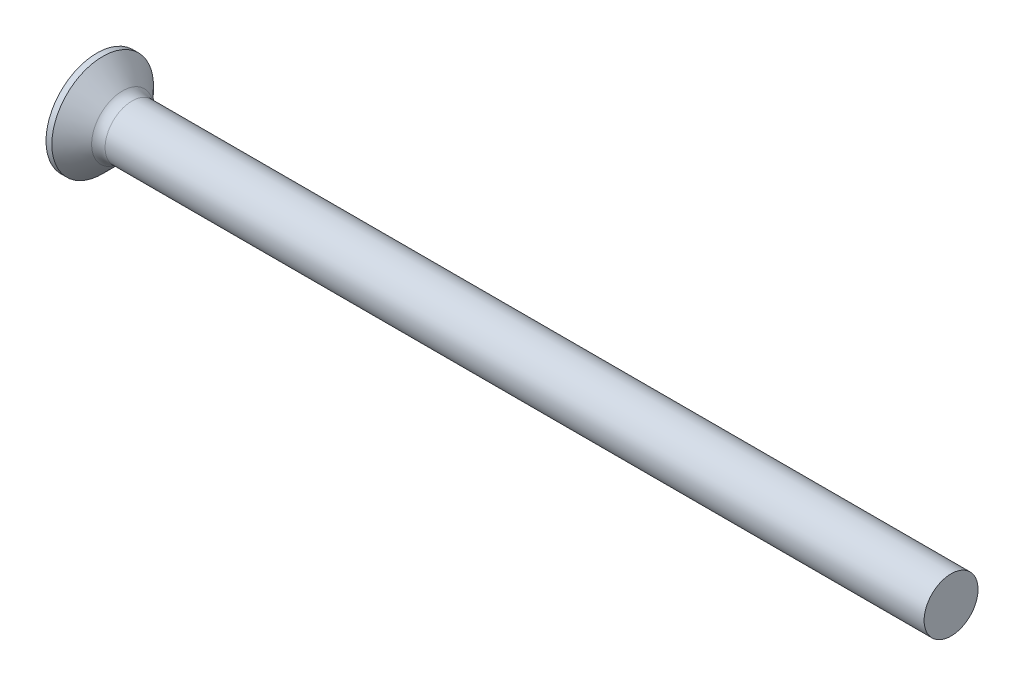
ISO-10303-21;
HEADER;
FILE_DESCRIPTION(('STEP AP214'),'2;1');
FILE_NAME('part.step','',(''),(''),'','','');
FILE_SCHEMA(('AUTOMOTIVE_DESIGN { 1 0 10303 214 1 1 1 1 }'));
ENDSEC;
DATA;
#1=APPLICATION_CONTEXT('core data for automotive mechanical design processes');
#2=APPLICATION_PROTOCOL_DEFINITION('international standard','automotive_design',2000,#1);
#3=PRODUCT_CONTEXT('',#1,'mechanical');
#4=PRODUCT('Part','Part','',(#3));
#5=PRODUCT_RELATED_PRODUCT_CATEGORY('part','',(#4));
#6=PRODUCT_DEFINITION_FORMATION('','',#4);
#7=PRODUCT_DEFINITION_CONTEXT('part definition',#1,'design');
#8=PRODUCT_DEFINITION('design','',#6,#7);
#9=PRODUCT_DEFINITION_SHAPE('','',#8);
#10=(LENGTH_UNIT() NAMED_UNIT(*) SI_UNIT(.MILLI.,.METRE.));
#11=(NAMED_UNIT(*) PLANE_ANGLE_UNIT() SI_UNIT($,.RADIAN.));
#12=(NAMED_UNIT(*) SI_UNIT($,.STERADIAN.) SOLID_ANGLE_UNIT());
#13=UNCERTAINTY_MEASURE_WITH_UNIT(LENGTH_MEASURE(1.E-05),#10,'distance_accuracy_value','');
#14=(GEOMETRIC_REPRESENTATION_CONTEXT(3) GLOBAL_UNCERTAINTY_ASSIGNED_CONTEXT((#13)) GLOBAL_UNIT_ASSIGNED_CONTEXT((#10,
#11,#12)) REPRESENTATION_CONTEXT('',''));
#15=CARTESIAN_POINT('',(0.,0.,0.));
#16=DIRECTION('',(0.,0.,1.));
#17=DIRECTION('',(1.,0.,0.));
#18=AXIS2_PLACEMENT_3D('',#15,#16,#17);
#19=CARTESIAN_POINT('',(3.45,-1.57989373987161,0.71));
#20=DIRECTION('',(0.,0.,-1.));
#21=DIRECTION('',(0.,1.,0.));
#22=AXIS2_PLACEMENT_3D('',#19,#20,#21);
#23=PLANE('',#22);
#24=DIRECTION('',(0.,-1.,0.));
#25=VECTOR('',#24,1.);
#26=CARTESIAN_POINT('',(0.,3.3,0.71));
#27=LINE('',#26,#25);
#28=CARTESIAN_POINT('',(0.,-1.34596265082799,0.71));
#29=VERTEX_POINT('',#28);
#30=CARTESIAN_POINT('',(0.,-3.3,0.71));
#31=VERTEX_POINT('',#30);
#32=EDGE_CURVE('E362',#29,#31,#27,.T.);
#33=ORIENTED_EDGE('',*,*,#32,.F.);
#34=CARTESIAN_POINT('',(-2.33070172998508,-1.52780949048026,0.71));
#35=CARTESIAN_POINT('',(-1.86765508847817,-1.49209744049213,0.71));
#36=CARTESIAN_POINT('',(-1.40462429920518,-1.45617785782921,0.71));
#37=CARTESIAN_POINT('',(-0.478598771397554,-1.38378441953518,0.71));
#38=CARTESIAN_POINT('',(-0.0156040335424541,-1.34731055521733,0.71));
#39=CARTESIAN_POINT('',(0.910330236395164,-1.27367048002272,0.71));
#40=CARTESIAN_POINT('',(1.37326976851081,-1.23650426956357,0.71));
#41=CARTESIAN_POINT('',(2.06762023653994,-1.18007469405108,0.71));
#42=CARTESIAN_POINT('',(2.29905881427871,-1.16115160652012,0.71));
#43=CARTESIAN_POINT('',(2.76191562133488,-1.1230403895321,0.71));
#44=CARTESIAN_POINT('',(2.9933338505087,-1.10385225833565,0.71));
#45=CARTESIAN_POINT('',(3.77873671984917,-1.0382140373185,0.71));
#46=CARTESIAN_POINT('',(4.33266232972328,-0.991049175883736,0.71));
#47=CARTESIAN_POINT('',(5.16336946909758,-0.91831891167068,0.71));
#48=CARTESIAN_POINT('',(5.44023782344519,-0.893745347104483,0.71));
#49=CARTESIAN_POINT('',(5.99389989386117,-0.843746126629444,0.71));
#50=CARTESIAN_POINT('',(6.27069360937684,-0.818320464576652,0.71));
#51=CARTESIAN_POINT('',(6.82421204003487,-0.766348392465499,0.71));
#52=CARTESIAN_POINT('',(7.10093674169551,-0.739801838455807,0.710000000000001));
#53=CARTESIAN_POINT('',(7.65423177691247,-0.685185750837109,0.710000000000001));
#54=CARTESIAN_POINT('',(7.93080211342568,-0.657116247487932,0.71));
#55=CARTESIAN_POINT('',(8.34549763265326,-0.613341372671412,0.710000000000001));
#56=CARTESIAN_POINT('',(8.48371076462783,-0.598470406405424,0.710000000000001));
#57=CARTESIAN_POINT('',(8.76005877549585,-0.568027000653935,0.710000000000001));
#58=CARTESIAN_POINT('',(8.8981936550194,-0.552454566900561,0.710000000000001));
#59=CARTESIAN_POINT('',(9.17437105230597,-0.520423781188749,0.710000000000001));
#60=CARTESIAN_POINT('',(9.31241356323649,-0.503965369751122,0.710000000000001));
#61=CARTESIAN_POINT('',(9.58835148685425,-0.469831580758203,0.710000000000001));
#62=CARTESIAN_POINT('',(9.72624689529722,-0.452156169004852,0.710000000000001));
#63=CARTESIAN_POINT('',(9.86404214924836,-0.433706703068897,0.710000000000001));
#64=B_SPLINE_CURVE_WITH_KNOTS('',3,(#34,#35,#36,#37,#38,#39,#40,#41,#42,#43,#44,#45,#46,#47,#48,
#49,#50,#51,#52,#53,#54,#55,#56,#57,#58,#59,#60,#61,#62,#63),.UNSPECIFIED.,.F.,.F.,(4,2,2,2,2,2,
2,2,2,2,2,2,2,2,4),(0.,1.39326536277937,2.78655258345763,4.17983896374136,4.87647147762522,
5.57310856540425,7.2408931063301,8.07476240245647,8.90863771239455,9.74262044102709,
10.5765866051289,10.9936177320625,11.4106454517929,11.8277012032456,12.2447686788719),.UNSPECIFIED.);
#65=CARTESIAN_POINT('',(3.45,-1.06563607765503,0.710000000000001));
#66=VERTEX_POINT('',#65);
#67=EDGE_CURVE('E204',#29,#66,#64,.T.);
#68=ORIENTED_EDGE('',*,*,#67,.T.);
#69=DIRECTION('',(0.,-1.,0.));
#70=VECTOR('',#69,1.);
#71=CARTESIAN_POINT('',(3.45,1.57989373987161,0.71));
#72=LINE('',#71,#70);
#73=CARTESIAN_POINT('',(3.45,-1.57989373987161,0.71));
#74=VERTEX_POINT('',#73);
#75=EDGE_CURVE('E394',#66,#74,#72,.T.);
#76=ORIENTED_EDGE('',*,*,#75,.T.);
#77=DIRECTION('',(0.894934391398442,0.446197753347436,0.));
#78=VECTOR('',#77,1.);
#79=CARTESIAN_POINT('',(0.,-3.3,0.71));
#80=LINE('',#79,#78);
#81=EDGE_CURVE('E376',#31,#74,#80,.T.);
#82=ORIENTED_EDGE('',*,*,#81,.F.);
#83=EDGE_LOOP('',(#33,#68,#76,#82));
#84=FACE_BOUND('',#83,.T.);
#85=ADVANCED_FACE('F45',(#84),#23,.T.);
#86=CARTESIAN_POINT('',(3.45,1.57989373987161,0.71));
#87=VERTEX_POINT('',#86);
#88=CARTESIAN_POINT('',(3.45,1.06563607765503,0.710000000000001));
#89=VERTEX_POINT('',#88);
#90=EDGE_CURVE('E396',#87,#89,#72,.T.);
#91=ORIENTED_EDGE('',*,*,#90,.T.);
#92=CARTESIAN_POINT('',(-2.33070172998508,1.52780949048026,0.71));
#93=CARTESIAN_POINT('',(-1.86765508847817,1.49209744049213,0.71));
#94=CARTESIAN_POINT('',(-1.40462429920518,1.45617785782921,0.71));
#95=CARTESIAN_POINT('',(-0.478598771397554,1.38378441953518,0.71));
#96=CARTESIAN_POINT('',(-0.0156040335424542,1.34731055521733,0.71));
#97=CARTESIAN_POINT('',(0.910330236395165,1.27367048002272,0.71));
#98=CARTESIAN_POINT('',(1.37326976851081,1.23650426956357,0.71));
#99=CARTESIAN_POINT('',(2.06762023653994,1.18007469405108,0.71));
#100=CARTESIAN_POINT('',(2.29905881427871,1.16115160652012,0.71));
#101=CARTESIAN_POINT('',(2.76191562133488,1.1230403895321,0.71));
#102=CARTESIAN_POINT('',(2.9933338505087,1.10385225833566,0.71));
#103=CARTESIAN_POINT('',(3.77873671984917,1.0382140373185,0.71));
#104=CARTESIAN_POINT('',(4.33266232972328,0.991049175883736,0.71));
#105=CARTESIAN_POINT('',(5.16336946909758,0.91831891167068,0.71));
#106=CARTESIAN_POINT('',(5.4402378234452,0.893745347104483,0.71));
#107=CARTESIAN_POINT('',(5.99389989386117,0.843746126629444,0.71));
#108=CARTESIAN_POINT('',(6.27069360937684,0.818320464576652,0.71));
#109=CARTESIAN_POINT('',(6.82421204003487,0.766348392465498,0.71));
#110=CARTESIAN_POINT('',(7.10093674169551,0.739801838455807,0.71));
#111=CARTESIAN_POINT('',(7.65423177691248,0.685185750837109,0.71));
#112=CARTESIAN_POINT('',(7.93080211342568,0.657116247487932,0.71));
#113=CARTESIAN_POINT('',(8.34549763265326,0.613341372671412,0.71));
#114=CARTESIAN_POINT('',(8.48371076462783,0.598470406405424,0.710000000000001));
#115=CARTESIAN_POINT('',(8.76005877549585,0.568027000653935,0.710000000000001));
#116=CARTESIAN_POINT('',(8.89819365501941,0.55245456690056,0.710000000000001));
#117=CARTESIAN_POINT('',(9.17437105230597,0.520423781188749,0.710000000000001));
#118=CARTESIAN_POINT('',(9.31241356323649,0.503965369751121,0.710000000000001));
#119=CARTESIAN_POINT('',(9.58835148685426,0.469831580758203,0.710000000000001));
#120=CARTESIAN_POINT('',(9.72624689529723,0.452156169004851,0.710000000000001));
#121=CARTESIAN_POINT('',(9.86404214924837,0.433706703068896,0.710000000000001));
#122=B_SPLINE_CURVE_WITH_KNOTS('',3,(#92,#93,#94,#95,#96,#97,#98,#99,#100,#101,#102,#103,#104,
#105,#106,#107,#108,#109,#110,#111,#112,#113,#114,#115,#116,#117,#118,#119,#120,#121),
.UNSPECIFIED.,.F.,.F.,(4,2,2,2,2,2,2,2,2,2,2,2,2,2,4),(0.,1.39326536277937,2.78655258345763,
4.17983896374136,4.87647147762522,5.57310856540425,7.2408931063301,8.07476240245648,
8.90863771239455,9.7426204410271,10.5765866051289,10.9936177320625,11.4106454517929,
11.8277012032456,12.244768678872),.UNSPECIFIED.);
#123=CARTESIAN_POINT('',(0.,1.34596265082799,0.71));
#124=VERTEX_POINT('',#123);
#125=EDGE_CURVE('E197',#89,#124,#122,.F.);
#126=ORIENTED_EDGE('',*,*,#125,.T.);
#127=CARTESIAN_POINT('',(0.,3.3,0.71));
#128=VERTEX_POINT('',#127);
#129=EDGE_CURVE('E364',#128,#124,#27,.T.);
#130=ORIENTED_EDGE('',*,*,#129,.F.);
#131=DIRECTION('',(0.894934391398442,-0.446197753347436,0.));
#132=VECTOR('',#131,1.);
#133=CARTESIAN_POINT('',(0.,3.3,0.71));
#134=LINE('',#133,#132);
#135=EDGE_CURVE('E75',#128,#87,#134,.T.);
#136=ORIENTED_EDGE('',*,*,#135,.T.);
#137=EDGE_LOOP('',(#91,#126,#130,#136));
#138=FACE_BOUND('',#137,.T.);
#139=ADVANCED_FACE('F179',(#138),#23,.T.);
#140=CARTESIAN_POINT('',(3.45,1.57989373987161,-0.71));
#141=DIRECTION('',(0.,0.,1.));
#142=DIRECTION('',(1.,0.,0.));
#143=AXIS2_PLACEMENT_3D('',#140,#141,#142);
#144=PLANE('',#143);
#145=DIRECTION('',(0.,1.,0.));
#146=VECTOR('',#145,1.);
#147=CARTESIAN_POINT('',(3.45,-1.57989373987161,-0.71));
#148=LINE('',#147,#146);
#149=CARTESIAN_POINT('',(3.45,-1.57989373987161,-0.71));
#150=VERTEX_POINT('',#149);
#151=CARTESIAN_POINT('',(3.45,-1.06563607765503,-0.710000000000001));
#152=VERTEX_POINT('',#151);
#153=EDGE_CURVE('E395',#150,#152,#148,.T.);
#154=ORIENTED_EDGE('',*,*,#153,.T.);
#155=CARTESIAN_POINT('',(-2.33070173866617,-1.52780949114965,-0.709999999999999));
#156=CARTESIAN_POINT('',(-1.8676550960516,-1.49209744107883,-0.709999999999999));
#157=CARTESIAN_POINT('',(-1.40462430567099,-1.45617785833256,-0.709999999999999));
#158=CARTESIAN_POINT('',(-0.478598775648203,-1.38378441986965,-0.709999999999999));
#159=CARTESIAN_POINT('',(-0.0156040366855547,-1.34731055546627,-0.709999999999999));
#160=CARTESIAN_POINT('',(0.910330236180616,-1.27367048004082,-0.709999999999999));
#161=CARTESIAN_POINT('',(1.37326977011718,-1.2365042694353,-0.71));
#162=CARTESIAN_POINT('',(2.06762024087716,-1.18007469369746,-0.71));
#163=CARTESIAN_POINT('',(2.29905881952609,-1.16115160609042,-0.71));
#164=CARTESIAN_POINT('',(2.76191562840241,-1.12304038894781,-0.71));
#165=CARTESIAN_POINT('',(2.99333385848622,-1.10385225767286,-0.71));
#166=CARTESIAN_POINT('',(3.77873672873618,-1.03821403656624,-0.71));
#167=CARTESIAN_POINT('',(4.33266233860976,-0.991049175120264,-0.71));
#168=CARTESIAN_POINT('',(5.16336947798272,-0.918318910885573,-0.71));
#169=CARTESIAN_POINT('',(5.44023783232976,-0.893745346311364,-0.71));
#170=CARTESIAN_POINT('',(5.99389990274437,-0.843746125817967,-0.71));
#171=CARTESIAN_POINT('',(6.27069361825925,-0.818320463754828,-0.710000000000001));
#172=CARTESIAN_POINT('',(6.82421204891561,-0.766348391619469,-0.710000000000001));
#173=CARTESIAN_POINT('',(7.10093675057538,-0.739801837595919,-0.710000000000001));
#174=CARTESIAN_POINT('',(7.65423178578991,-0.685185749944022,-0.710000000000001));
#175=CARTESIAN_POINT('',(7.93080212230155,-0.657116246575506,-0.710000000000001));
#176=CARTESIAN_POINT('',(8.34549764152603,-0.613341371722656,-0.710000000000001));
#177=CARTESIAN_POINT('',(8.48371077349952,-0.598470405443329,-0.710000000000001));
#178=CARTESIAN_POINT('',(8.7600587843649,-0.568026999661668,-0.710000000000001));
#179=CARTESIAN_POINT('',(8.89819366388689,-0.552454565891462,-0.710000000000001));
#180=CARTESIAN_POINT('',(9.17437106116977,-0.520423780141057,-0.710000000000001));
#181=CARTESIAN_POINT('',(9.31241357209815,-0.503965368681667,-0.710000000000001));
#182=CARTESIAN_POINT('',(9.58835149571046,-0.469831579636991,-0.710000000000001));
#183=CARTESIAN_POINT('',(9.7262469041501,-0.452156167853644,-0.710000000000001));
#184=CARTESIAN_POINT('',(9.86404215809699,-0.433706701881926,-0.710000000000001));
#185=B_SPLINE_CURVE_WITH_KNOTS('',3,(#155,#156,#157,#158,#159,#160,#161,#162,#163,#164,#165,
#166,#167,#168,#169,#170,#171,#172,#173,#174,#175,#176,#177,#178,#179,#180,#181,#182,#183,#184),
.UNSPECIFIED.,.F.,.F.,(4,2,2,2,2,2,2,2,2,2,2,2,2,2,4),(0.,1.3932653661116,2.78655259012239,
4.17983897588649,4.87647149251036,5.57310858302948,7.24089312395658,8.07476242008335,
8.90863773002189,9.74262045865578,10.5765866227588,10.9936177496934,11.4106454694248,
11.8277012208788,12.2447686965066),.UNSPECIFIED.);
#186=CARTESIAN_POINT('',(0.,-1.34596265082799,-0.709999999999999));
#187=VERTEX_POINT('',#186);
#188=EDGE_CURVE('E251',#152,#187,#185,.F.);
#189=ORIENTED_EDGE('',*,*,#188,.T.);
#190=DIRECTION('',(0.,1.,0.));
#191=VECTOR('',#190,1.);
#192=CARTESIAN_POINT('',(0.,-3.3,-0.709999999999999));
#193=LINE('',#192,#191);
#194=CARTESIAN_POINT('',(0.,-3.3,-0.709999999999999));
#195=VERTEX_POINT('',#194);
#196=EDGE_CURVE('E363',#195,#187,#193,.T.);
#197=ORIENTED_EDGE('',*,*,#196,.F.);
#198=DIRECTION('',(0.894934391398442,0.446197753347436,0.));
#199=VECTOR('',#198,1.);
#200=CARTESIAN_POINT('',(0.,-3.3,-0.709999999999999));
#201=LINE('',#200,#199);
#202=EDGE_CURVE('E380',#195,#150,#201,.T.);
#203=ORIENTED_EDGE('',*,*,#202,.T.);
#204=EDGE_LOOP('',(#154,#189,#197,#203));
#205=FACE_BOUND('',#204,.T.);
#206=ADVANCED_FACE('F185',(#205),#144,.T.);
#207=CARTESIAN_POINT('',(0.,1.34596265082799,-0.709999999999999));
#208=VERTEX_POINT('',#207);
#209=CARTESIAN_POINT('',(0.,3.3,-0.709999999999999));
#210=VERTEX_POINT('',#209);
#211=EDGE_CURVE('E375',#208,#210,#193,.T.);
#212=ORIENTED_EDGE('',*,*,#211,.F.);
#213=CARTESIAN_POINT('',(-2.33070173866617,1.52780949114965,-0.709999999999999));
#214=CARTESIAN_POINT('',(-1.8676550960516,1.49209744107883,-0.709999999999999));
#215=CARTESIAN_POINT('',(-1.40462430567099,1.45617785833256,-0.709999999999999));
#216=CARTESIAN_POINT('',(-0.478598775648203,1.38378441986965,-0.709999999999999));
#217=CARTESIAN_POINT('',(-0.0156040366855546,1.34731055546627,-0.709999999999999));
#218=CARTESIAN_POINT('',(0.910330236180616,1.27367048004082,-0.709999999999999));
#219=CARTESIAN_POINT('',(1.37326977011718,1.2365042694353,-0.71));
#220=CARTESIAN_POINT('',(2.06762024087716,1.18007469369746,-0.71));
#221=CARTESIAN_POINT('',(2.29905881952609,1.16115160609042,-0.71));
#222=CARTESIAN_POINT('',(2.76191562840241,1.12304038894781,-0.71));
#223=CARTESIAN_POINT('',(2.99333385848622,1.10385225767286,-0.71));
#224=CARTESIAN_POINT('',(3.77873672873618,1.03821403656624,-0.71));
#225=CARTESIAN_POINT('',(4.33266233860976,0.991049175120264,-0.71));
#226=CARTESIAN_POINT('',(5.16336947798272,0.918318910885573,-0.71));
#227=CARTESIAN_POINT('',(5.44023783232976,0.893745346311365,-0.71));
#228=CARTESIAN_POINT('',(5.99389990274436,0.843746125817967,-0.71));
#229=CARTESIAN_POINT('',(6.27069361825924,0.818320463754828,-0.710000000000001));
#230=CARTESIAN_POINT('',(6.82421204891561,0.76634839161947,-0.710000000000001));
#231=CARTESIAN_POINT('',(7.10093675057537,0.739801837595919,-0.710000000000001));
#232=CARTESIAN_POINT('',(7.6542317857899,0.685185749944022,-0.710000000000001));
#233=CARTESIAN_POINT('',(7.93080212230155,0.657116246575506,-0.710000000000001));
#234=CARTESIAN_POINT('',(8.34549764152603,0.613341371722656,-0.710000000000001));
#235=CARTESIAN_POINT('',(8.48371077349952,0.59847040544333,-0.710000000000001));
#236=CARTESIAN_POINT('',(8.76005878436489,0.568026999661669,-0.710000000000001));
#237=CARTESIAN_POINT('',(8.89819366388689,0.552454565891463,-0.710000000000001));
#238=CARTESIAN_POINT('',(9.17437106116977,0.520423780141058,-0.710000000000001));
#239=CARTESIAN_POINT('',(9.31241357209815,0.503965368681668,-0.710000000000001));
#240=CARTESIAN_POINT('',(9.58835149571045,0.469831579636992,-0.710000000000001));
#241=CARTESIAN_POINT('',(9.72624690415009,0.452156167853645,-0.710000000000001));
#242=CARTESIAN_POINT('',(9.86404215809699,0.433706701881927,-0.710000000000001));
#243=B_SPLINE_CURVE_WITH_KNOTS('',3,(#213,#214,#215,#216,#217,#218,#219,#220,#221,#222,#223,
#224,#225,#226,#227,#228,#229,#230,#231,#232,#233,#234,#235,#236,#237,#238,#239,#240,#241,#242),
.UNSPECIFIED.,.F.,.F.,(4,2,2,2,2,2,2,2,2,2,2,2,2,2,4),(0.,1.3932653661116,2.78655259012239,
4.17983897588649,4.87647149251036,5.57310858302948,7.24089312395658,8.07476242008335,
8.90863773002189,9.74262045865578,10.5765866227588,10.9936177496934,11.4106454694247,
11.8277012208788,12.2447686965066),.UNSPECIFIED.);
#244=CARTESIAN_POINT('',(3.45,1.06563607765503,-0.710000000000001));
#245=VERTEX_POINT('',#244);
#246=EDGE_CURVE('E246',#208,#245,#243,.T.);
#247=ORIENTED_EDGE('',*,*,#246,.T.);
#248=CARTESIAN_POINT('',(3.45,1.57989373987161,-0.71));
#249=VERTEX_POINT('',#248);
#250=EDGE_CURVE('E404',#245,#249,#148,.T.);
#251=ORIENTED_EDGE('',*,*,#250,.T.);
#252=DIRECTION('',(0.894934391398442,-0.446197753347436,0.));
#253=VECTOR('',#252,1.);
#254=CARTESIAN_POINT('',(0.,3.3,-0.709999999999999));
#255=LINE('',#254,#253);
#256=EDGE_CURVE('E386',#210,#249,#255,.T.);
#257=ORIENTED_EDGE('',*,*,#256,.F.);
#258=EDGE_LOOP('',(#212,#247,#251,#257));
#259=FACE_BOUND('',#258,.T.);
#260=ADVANCED_FACE('F639',(#259),#144,.T.);
#261=CARTESIAN_POINT('',(3.45,1.57989373987161,-0.71));
#262=DIRECTION('',(1.,0.,0.));
#263=DIRECTION('',(0.,0.,-1.));
#264=AXIS2_PLACEMENT_3D('',#261,#262,#263);
#265=PLANE('',#264);
#266=CARTESIAN_POINT('',(3.45,0.,0.));
#267=DIRECTION('',(-1.,0.,0.));
#268=DIRECTION('',(0.,0.,1.));
#269=AXIS2_PLACEMENT_3D('',#266,#267,#268);
#270=CIRCLE('',#269,1.2805);
#271=EDGE_CURVE('E318',#152,#66,#270,.T.);
#272=ORIENTED_EDGE('',*,*,#271,.F.);
#273=ORIENTED_EDGE('',*,*,#153,.F.);
#274=DIRECTION('',(0.,0.,-1.));
#275=VECTOR('',#274,1.);
#276=CARTESIAN_POINT('',(3.45,-1.57989373987161,0.71));
#277=LINE('',#276,#275);
#278=EDGE_CURVE('E390',#74,#150,#277,.T.);
#279=ORIENTED_EDGE('',*,*,#278,.F.);
#280=ORIENTED_EDGE('',*,*,#75,.F.);
#281=EDGE_LOOP('',(#272,#273,#279,#280));
#282=FACE_BOUND('',#281,.T.);
#283=ADVANCED_FACE('F497',(#282),#265,.F.);
#284=CARTESIAN_POINT('',(3.45,-0.710000000000004,1.06563607765503));
#285=VERTEX_POINT('',#284);
#286=CARTESIAN_POINT('',(3.45,0.709999999999996,1.06563607765503));
#287=VERTEX_POINT('',#286);
#288=EDGE_CURVE('E306',#285,#287,#270,.T.);
#289=ORIENTED_EDGE('',*,*,#288,.F.);
#290=DIRECTION('',(0.,0.,-1.));
#291=VECTOR('',#290,1.);
#292=CARTESIAN_POINT('',(3.45,-0.710000000000006,1.5798937398716));
#293=LINE('',#292,#291);
#294=CARTESIAN_POINT('',(3.45,-0.710000000000006,1.5798937398716));
#295=VERTEX_POINT('',#294);
#296=EDGE_CURVE('E477',#295,#285,#293,.T.);
#297=ORIENTED_EDGE('',*,*,#296,.F.);
#298=DIRECTION('',(0.,-1.,0.));
#299=VECTOR('',#298,1.);
#300=CARTESIAN_POINT('',(3.45,0.709999999999994,1.57989373987161));
#301=LINE('',#300,#299);
#302=CARTESIAN_POINT('',(3.45,0.709999999999994,1.57989373987161));
#303=VERTEX_POINT('',#302);
#304=EDGE_CURVE('E347',#303,#295,#301,.T.);
#305=ORIENTED_EDGE('',*,*,#304,.F.);
#306=DIRECTION('',(0.,0.,1.));
#307=VECTOR('',#306,1.);
#308=CARTESIAN_POINT('',(3.45,0.710000000000005,-1.5798937398716));
#309=LINE('',#308,#307);
#310=EDGE_CURVE('E212',#287,#303,#309,.T.);
#311=ORIENTED_EDGE('',*,*,#310,.F.);
#312=EDGE_LOOP('',(#289,#297,#305,#311));
#313=FACE_BOUND('',#312,.T.);
#314=ADVANCED_FACE('F631',(#313),#265,.F.);
#315=EDGE_CURVE('E305',#89,#245,#270,.T.);
#316=ORIENTED_EDGE('',*,*,#315,.F.);
#317=ORIENTED_EDGE('',*,*,#90,.F.);
#318=DIRECTION('',(0.,0.,1.));
#319=VECTOR('',#318,1.);
#320=CARTESIAN_POINT('',(3.45,1.57989373987161,-0.71));
#321=LINE('',#320,#319);
#322=EDGE_CURVE('E391',#249,#87,#321,.T.);
#323=ORIENTED_EDGE('',*,*,#322,.F.);
#324=ORIENTED_EDGE('',*,*,#250,.F.);
#325=EDGE_LOOP('',(#316,#317,#323,#324));
#326=FACE_BOUND('',#325,.T.);
#327=ADVANCED_FACE('F611',(#326),#265,.F.);
#328=CARTESIAN_POINT('',(3.45,0.709999999999994,1.57989373987161));
#329=DIRECTION('',(0.,-1.,0.));
#330=DIRECTION('',(1.,0.,0.));
#331=AXIS2_PLACEMENT_3D('',#328,#329,#330);
#332=PLANE('',#331);
#333=CARTESIAN_POINT('',(3.45,0.710000000000005,-1.5798937398716));
#334=VERTEX_POINT('',#333);
#335=CARTESIAN_POINT('',(3.45,0.710000000000004,-1.06563607765503));
#336=VERTEX_POINT('',#335);
#337=EDGE_CURVE('E341',#334,#336,#309,.T.);
#338=ORIENTED_EDGE('',*,*,#337,.T.);
#339=CARTESIAN_POINT('',(-2.33070173866617,0.710000000000004,-1.52780949114964));
#340=CARTESIAN_POINT('',(-1.8676550960516,0.710000000000004,-1.49209744107883));
#341=CARTESIAN_POINT('',(-1.40462430567099,0.710000000000004,-1.45617785833256));
#342=CARTESIAN_POINT('',(-0.478598775648202,0.710000000000004,-1.38378441986965));
#343=CARTESIAN_POINT('',(-0.0156040366855544,0.710000000000004,-1.34731055546627));
#344=CARTESIAN_POINT('',(0.910330236180616,0.710000000000004,-1.27367048004082));
#345=CARTESIAN_POINT('',(1.37326977011718,0.710000000000004,-1.2365042694353));
#346=CARTESIAN_POINT('',(2.06762024087716,0.710000000000004,-1.18007469369746));
#347=CARTESIAN_POINT('',(2.29905881952609,0.710000000000004,-1.16115160609042));
#348=CARTESIAN_POINT('',(2.76191562840241,0.710000000000004,-1.12304038894781));
#349=CARTESIAN_POINT('',(2.99333385848622,0.710000000000004,-1.10385225767286));
#350=CARTESIAN_POINT('',(3.77873672873618,0.710000000000004,-1.03821403656624));
#351=CARTESIAN_POINT('',(4.33266233860976,0.710000000000004,-0.991049175120262));
#352=CARTESIAN_POINT('',(5.16336947798272,0.710000000000004,-0.91831891088557));
#353=CARTESIAN_POINT('',(5.44023783232976,0.710000000000003,-0.893745346311362));
#354=CARTESIAN_POINT('',(5.99389990274437,0.710000000000003,-0.843746125817964));
#355=CARTESIAN_POINT('',(6.27069361825925,0.710000000000003,-0.818320463754825));
#356=CARTESIAN_POINT('',(6.82421204891561,0.710000000000003,-0.766348391619467));
#357=CARTESIAN_POINT('',(7.10093675057537,0.710000000000003,-0.739801837595917));
#358=CARTESIAN_POINT('',(7.6542317857899,0.710000000000003,-0.68518574994402));
#359=CARTESIAN_POINT('',(7.93080212230155,0.710000000000003,-0.657116246575503));
#360=CARTESIAN_POINT('',(8.34549764152603,0.710000000000003,-0.613341371722654));
#361=CARTESIAN_POINT('',(8.48371077349952,0.710000000000003,-0.598470405443327));
#362=CARTESIAN_POINT('',(8.7600587843649,0.710000000000003,-0.568026999661666));
#363=CARTESIAN_POINT('',(8.89819366388689,0.710000000000003,-0.55245456589146));
#364=CARTESIAN_POINT('',(9.17437106116977,0.710000000000003,-0.520423780141055));
#365=CARTESIAN_POINT('',(9.31241357209815,0.710000000000003,-0.503965368681665));
#366=CARTESIAN_POINT('',(9.58835149571046,0.710000000000003,-0.469831579636989));
#367=CARTESIAN_POINT('',(9.72624690415009,0.710000000000003,-0.452156167853642));
#368=CARTESIAN_POINT('',(9.86404215809699,0.710000000000003,-0.433706701881924));
#369=B_SPLINE_CURVE_WITH_KNOTS('',3,(#339,#340,#341,#342,#343,#344,#345,#346,#347,#348,#349,
#350,#351,#352,#353,#354,#355,#356,#357,#358,#359,#360,#361,#362,#363,#364,#365,#366,#367,#368),
.UNSPECIFIED.,.F.,.F.,(4,2,2,2,2,2,2,2,2,2,2,2,2,2,4),(0.,1.3932653661116,2.78655259012239,
4.17983897588649,4.87647149251036,5.57310858302948,7.24089312395658,8.07476242008335,
8.90863773002189,9.74262045865578,10.5765866227588,10.9936177496934,11.4106454694247,
11.8277012208788,12.2447686965066),.UNSPECIFIED.);
#370=CARTESIAN_POINT('',(0.,0.710000000000004,-1.34596265082799));
#371=VERTEX_POINT('',#370);
#372=EDGE_CURVE('E239',#336,#371,#369,.F.);
#373=ORIENTED_EDGE('',*,*,#372,.T.);
#374=DIRECTION('',(0.,0.,1.));
#375=VECTOR('',#374,1.);
#376=CARTESIAN_POINT('',(0.,0.710000000000011,-3.3));
#377=LINE('',#376,#375);
#378=CARTESIAN_POINT('',(0.,0.710000000000011,-3.3));
#379=VERTEX_POINT('',#378);
#380=EDGE_CURVE('E461',#379,#371,#377,.T.);
#381=ORIENTED_EDGE('',*,*,#380,.F.);
#382=DIRECTION('',(0.894934391398442,0.,0.446197753347436));
#383=VECTOR('',#382,1.);
#384=CARTESIAN_POINT('',(0.,0.710000000000011,-3.3));
#385=LINE('',#384,#383);
#386=EDGE_CURVE('E345',#379,#334,#385,.T.);
#387=ORIENTED_EDGE('',*,*,#386,.T.);
#388=EDGE_LOOP('',(#338,#373,#381,#387));
#389=FACE_BOUND('',#388,.T.);
#390=ADVANCED_FACE('F344',(#389),#332,.T.);
#391=CARTESIAN_POINT('',(3.45,-0.709999999999995,-1.57989373987161));
#392=DIRECTION('',(0.,1.,0.));
#393=DIRECTION('',(0.,0.,1.));
#394=AXIS2_PLACEMENT_3D('',#391,#392,#393);
#395=PLANE('',#394);
#396=DIRECTION('',(0.,0.,-1.));
#397=VECTOR('',#396,1.);
#398=CARTESIAN_POINT('',(0.,-0.710000000000011,3.3));
#399=LINE('',#398,#397);
#400=CARTESIAN_POINT('',(0.,-0.709999999999995,-1.345962650828));
#401=VERTEX_POINT('',#400);
#402=CARTESIAN_POINT('',(0.,-0.709999999999989,-3.3));
#403=VERTEX_POINT('',#402);
#404=EDGE_CURVE('E454',#401,#403,#399,.T.);
#405=ORIENTED_EDGE('',*,*,#404,.F.);
#406=CARTESIAN_POINT('',(-2.33070173866617,-0.709999999999995,-1.52780949114965));
#407=CARTESIAN_POINT('',(-1.8676550960516,-0.709999999999995,-1.49209744107883));
#408=CARTESIAN_POINT('',(-1.40462430567099,-0.709999999999995,-1.45617785833257));
#409=CARTESIAN_POINT('',(-0.478598775648203,-0.709999999999995,-1.38378441986965));
#410=CARTESIAN_POINT('',(-0.0156040366855546,-0.709999999999995,-1.34731055546627));
#411=CARTESIAN_POINT('',(0.910330236180616,-0.709999999999996,-1.27367048004082));
#412=CARTESIAN_POINT('',(1.37326977011718,-0.709999999999996,-1.2365042694353));
#413=CARTESIAN_POINT('',(2.06762024087716,-0.709999999999996,-1.18007469369747));
#414=CARTESIAN_POINT('',(2.29905881952609,-0.709999999999996,-1.16115160609043));
#415=CARTESIAN_POINT('',(2.76191562840241,-0.709999999999996,-1.12304038894781));
#416=CARTESIAN_POINT('',(2.99333385848622,-0.709999999999996,-1.10385225767286));
#417=CARTESIAN_POINT('',(3.77873672873618,-0.709999999999997,-1.03821403656624));
#418=CARTESIAN_POINT('',(4.33266233860976,-0.709999999999997,-0.991049175120266));
#419=CARTESIAN_POINT('',(5.16336947798272,-0.709999999999997,-0.918318910885575));
#420=CARTESIAN_POINT('',(5.44023783232976,-0.709999999999997,-0.893745346311367));
#421=CARTESIAN_POINT('',(5.99389990274437,-0.709999999999998,-0.84374612581797));
#422=CARTESIAN_POINT('',(6.27069361825925,-0.709999999999998,-0.81832046375483));
#423=CARTESIAN_POINT('',(6.82421204891561,-0.709999999999998,-0.766348391619472));
#424=CARTESIAN_POINT('',(7.10093675057538,-0.709999999999998,-0.739801837595922));
#425=CARTESIAN_POINT('',(7.6542317857899,-0.709999999999998,-0.685185749944025));
#426=CARTESIAN_POINT('',(7.93080212230155,-0.709999999999998,-0.657116246575509));
#427=CARTESIAN_POINT('',(8.34549764152603,-0.709999999999999,-0.613341371722659));
#428=CARTESIAN_POINT('',(8.48371077349952,-0.709999999999999,-0.598470405443332));
#429=CARTESIAN_POINT('',(8.7600587843649,-0.709999999999999,-0.568026999661671));
#430=CARTESIAN_POINT('',(8.89819366388689,-0.709999999999999,-0.552454565891465));
#431=CARTESIAN_POINT('',(9.17437106116977,-0.709999999999999,-0.520423780141061));
#432=CARTESIAN_POINT('',(9.31241357209815,-0.709999999999999,-0.503965368681671));
#433=CARTESIAN_POINT('',(9.58835149571046,-0.709999999999999,-0.469831579636995));
#434=CARTESIAN_POINT('',(9.72624690415009,-0.709999999999999,-0.452156167853648));
#435=CARTESIAN_POINT('',(9.86404215809699,-0.709999999999999,-0.43370670188193));
#436=B_SPLINE_CURVE_WITH_KNOTS('',3,(#406,#407,#408,#409,#410,#411,#412,#413,#414,#415,#416,
#417,#418,#419,#420,#421,#422,#423,#424,#425,#426,#427,#428,#429,#430,#431,#432,#433,#434,#435),
.UNSPECIFIED.,.F.,.F.,(4,2,2,2,2,2,2,2,2,2,2,2,2,2,4),(0.,1.3932653661116,2.78655259012239,
4.17983897588649,4.87647149251036,5.57310858302948,7.24089312395658,8.07476242008335,
8.90863773002189,9.74262045865578,10.5765866227588,10.9936177496934,11.4106454694247,
11.8277012208788,12.2447686965066),.UNSPECIFIED.);
#437=CARTESIAN_POINT('',(3.45,-0.709999999999997,-1.06563607765503));
#438=VERTEX_POINT('',#437);
#439=EDGE_CURVE('E232',#401,#438,#436,.T.);
#440=ORIENTED_EDGE('',*,*,#439,.T.);
#441=CARTESIAN_POINT('',(3.45,-0.709999999999995,-1.57989373987161));
#442=VERTEX_POINT('',#441);
#443=EDGE_CURVE('E343',#438,#442,#293,.T.);
#444=ORIENTED_EDGE('',*,*,#443,.T.);
#445=DIRECTION('',(0.894934391398442,0.,0.446197753347436));
#446=VECTOR('',#445,1.);
#447=CARTESIAN_POINT('',(0.,-0.709999999999989,-3.3));
#448=LINE('',#447,#446);
#449=EDGE_CURVE('E465',#403,#442,#448,.T.);
#450=ORIENTED_EDGE('',*,*,#449,.F.);
#451=EDGE_LOOP('',(#405,#440,#444,#450));
#452=FACE_BOUND('',#451,.T.);
#453=ADVANCED_FACE('F485',(#452),#395,.T.);
#454=ORIENTED_EDGE('',*,*,#296,.T.);
#455=CARTESIAN_POINT('',(-2.33070172998508,-0.710000000000005,1.52780949048025));
#456=CARTESIAN_POINT('',(-1.86765508847817,-0.710000000000005,1.49209744049212));
#457=CARTESIAN_POINT('',(-1.40462429920518,-0.710000000000005,1.45617785782921));
#458=CARTESIAN_POINT('',(-0.478598771397555,-0.710000000000005,1.38378441953518));
#459=CARTESIAN_POINT('',(-0.0156040335424545,-0.710000000000005,1.34731055521733));
#460=CARTESIAN_POINT('',(0.910330236395165,-0.710000000000004,1.27367048002272));
#461=CARTESIAN_POINT('',(1.37326976851081,-0.710000000000004,1.23650426956357));
#462=CARTESIAN_POINT('',(2.06762023653994,-0.710000000000004,1.18007469405108));
#463=CARTESIAN_POINT('',(2.29905881427871,-0.710000000000004,1.16115160652012));
#464=CARTESIAN_POINT('',(2.76191562133488,-0.710000000000004,1.12304038953209));
#465=CARTESIAN_POINT('',(2.9933338505087,-0.710000000000004,1.10385225833565));
#466=CARTESIAN_POINT('',(3.77873671984917,-0.710000000000004,1.0382140373185));
#467=CARTESIAN_POINT('',(4.33266232972328,-0.710000000000004,0.991049175883733));
#468=CARTESIAN_POINT('',(5.16336946909758,-0.710000000000004,0.918318911670677));
#469=CARTESIAN_POINT('',(5.44023782344519,-0.710000000000004,0.89374534710448));
#470=CARTESIAN_POINT('',(5.99389989386117,-0.710000000000003,0.843746126629442));
#471=CARTESIAN_POINT('',(6.27069360937684,-0.710000000000003,0.81832046457665));
#472=CARTESIAN_POINT('',(6.82421204003487,-0.710000000000003,0.766348392465496));
#473=CARTESIAN_POINT('',(7.10093674169551,-0.710000000000003,0.739801838455805));
#474=CARTESIAN_POINT('',(7.65423177691247,-0.710000000000003,0.685185750837106));
#475=CARTESIAN_POINT('',(7.93080211342568,-0.710000000000003,0.65711624748793));
#476=CARTESIAN_POINT('',(8.34549763265325,-0.710000000000003,0.613341372671409));
#477=CARTESIAN_POINT('',(8.48371076462783,-0.710000000000003,0.598470406405422));
#478=CARTESIAN_POINT('',(8.76005877549585,-0.710000000000002,0.568027000653933));
#479=CARTESIAN_POINT('',(8.8981936550194,-0.710000000000002,0.552454566900558));
#480=CARTESIAN_POINT('',(9.17437105230597,-0.710000000000002,0.520423781188747));
#481=CARTESIAN_POINT('',(9.31241356323648,-0.710000000000002,0.50396536975112));
#482=CARTESIAN_POINT('',(9.58835148685425,-0.710000000000002,0.469831580758201));
#483=CARTESIAN_POINT('',(9.72624689529722,-0.710000000000002,0.452156169004849));
#484=CARTESIAN_POINT('',(9.86404214924837,-0.710000000000002,0.433706703068894));
#485=B_SPLINE_CURVE_WITH_KNOTS('',3,(#455,#456,#457,#458,#459,#460,#461,#462,#463,#464,#465,
#466,#467,#468,#469,#470,#471,#472,#473,#474,#475,#476,#477,#478,#479,#480,#481,#482,#483,#484),
.UNSPECIFIED.,.F.,.F.,(4,2,2,2,2,2,2,2,2,2,2,2,2,2,4),(0.,1.39326536277937,2.78655258345763,
4.17983896374136,4.87647147762522,5.57310856540425,7.2408931063301,8.07476240245648,
8.90863771239455,9.7426204410271,10.5765866051289,10.9936177320625,11.4106454517929,
11.8277012032456,12.2447686788719),.UNSPECIFIED.);
#486=CARTESIAN_POINT('',(0.,-0.710000000000005,1.34596265082799));
#487=VERTEX_POINT('',#486);
#488=EDGE_CURVE('E224',#285,#487,#485,.F.);
#489=ORIENTED_EDGE('',*,*,#488,.T.);
#490=CARTESIAN_POINT('',(0.,-0.710000000000011,3.3));
#491=VERTEX_POINT('',#490);
#492=EDGE_CURVE('E449',#491,#487,#399,.T.);
#493=ORIENTED_EDGE('',*,*,#492,.F.);
#494=DIRECTION('',(0.894934391398442,0.,-0.446197753347436));
#495=VECTOR('',#494,1.);
#496=CARTESIAN_POINT('',(0.,-0.710000000000011,3.3));
#497=LINE('',#496,#495);
#498=EDGE_CURVE('E471',#491,#295,#497,.T.);
#499=ORIENTED_EDGE('',*,*,#498,.T.);
#500=EDGE_LOOP('',(#454,#489,#493,#499));
#501=FACE_BOUND('',#500,.T.);
#502=ADVANCED_FACE('F615',(#501),#395,.T.);
#503=CARTESIAN_POINT('',(0.,0.709999999999995,1.345962650828));
#504=VERTEX_POINT('',#503);
#505=CARTESIAN_POINT('',(0.,0.709999999999988,3.3));
#506=VERTEX_POINT('',#505);
#507=EDGE_CURVE('E464',#504,#506,#377,.T.);
#508=ORIENTED_EDGE('',*,*,#507,.F.);
#509=CARTESIAN_POINT('',(-2.33070173866617,0.709999999999993,1.52780949114965));
#510=CARTESIAN_POINT('',(-1.8676550960516,0.709999999999994,1.49209744107883));
#511=CARTESIAN_POINT('',(-1.40462430567099,0.709999999999994,1.45617785833257));
#512=CARTESIAN_POINT('',(-0.478598775648202,0.709999999999994,1.38378441986965));
#513=CARTESIAN_POINT('',(-0.0156040366855541,0.709999999999995,1.34731055546627));
#514=CARTESIAN_POINT('',(0.910330236180616,0.709999999999995,1.27367048004082));
#515=CARTESIAN_POINT('',(1.37326977011718,0.709999999999995,1.2365042694353));
#516=CARTESIAN_POINT('',(2.06762024087716,0.709999999999995,1.18007469369747));
#517=CARTESIAN_POINT('',(2.29905881952609,0.709999999999996,1.16115160609043));
#518=CARTESIAN_POINT('',(2.76191562840241,0.709999999999996,1.12304038894781));
#519=CARTESIAN_POINT('',(2.99333385848622,0.709999999999996,1.10385225767286));
#520=CARTESIAN_POINT('',(3.77873672873618,0.709999999999996,1.03821403656624));
#521=CARTESIAN_POINT('',(4.33266233860976,0.709999999999997,0.991049175120266));
#522=CARTESIAN_POINT('',(5.16336947798272,0.709999999999997,0.918318910885575));
#523=CARTESIAN_POINT('',(5.44023783232976,0.709999999999997,0.893745346311367));
#524=CARTESIAN_POINT('',(5.99389990274437,0.709999999999998,0.84374612581797));
#525=CARTESIAN_POINT('',(6.27069361825924,0.709999999999998,0.818320463754831));
#526=CARTESIAN_POINT('',(6.82421204891561,0.709999999999998,0.766348391619472));
#527=CARTESIAN_POINT('',(7.10093675057537,0.709999999999998,0.739801837595922));
#528=CARTESIAN_POINT('',(7.6542317857899,0.709999999999998,0.685185749944024));
#529=CARTESIAN_POINT('',(7.93080212230155,0.709999999999999,0.657116246575508));
#530=CARTESIAN_POINT('',(8.34549764152603,0.709999999999999,0.613341371722658));
#531=CARTESIAN_POINT('',(8.48371077349952,0.709999999999999,0.598470405443332));
#532=CARTESIAN_POINT('',(8.7600587843649,0.709999999999999,0.568026999661671));
#533=CARTESIAN_POINT('',(8.89819366388689,0.709999999999999,0.552454565891465));
#534=CARTESIAN_POINT('',(9.17437106116977,0.709999999999999,0.52042378014106));
#535=CARTESIAN_POINT('',(9.31241357209815,0.709999999999999,0.50396536868167));
#536=CARTESIAN_POINT('',(9.58835149571046,0.71,0.469831579636994));
#537=CARTESIAN_POINT('',(9.72624690415009,0.71,0.452156167853647));
#538=CARTESIAN_POINT('',(9.86404215809699,0.71,0.433706701881929));
#539=B_SPLINE_CURVE_WITH_KNOTS('',3,(#509,#510,#511,#512,#513,#514,#515,#516,#517,#518,#519,
#520,#521,#522,#523,#524,#525,#526,#527,#528,#529,#530,#531,#532,#533,#534,#535,#536,#537,#538),
.UNSPECIFIED.,.F.,.F.,(4,2,2,2,2,2,2,2,2,2,2,2,2,2,4),(0.,1.3932653661116,2.78655259012239,
4.17983897588649,4.87647149251036,5.57310858302948,7.24089312395658,8.07476242008335,
8.90863773002189,9.74262045865578,10.5765866227588,10.9936177496934,11.4106454694247,
11.8277012208788,12.2447686965066),.UNSPECIFIED.);
#540=EDGE_CURVE('E11',#504,#287,#539,.T.);
#541=ORIENTED_EDGE('',*,*,#540,.T.);
#542=ORIENTED_EDGE('',*,*,#310,.T.);
#543=DIRECTION('',(0.894934391398442,0.,-0.446197753347436));
#544=VECTOR('',#543,1.);
#545=CARTESIAN_POINT('',(0.,0.709999999999988,3.3));
#546=LINE('',#545,#544);
#547=EDGE_CURVE('E474',#506,#303,#546,.T.);
#548=ORIENTED_EDGE('',*,*,#547,.F.);
#549=EDGE_LOOP('',(#508,#541,#542,#548));
#550=FACE_BOUND('',#549,.T.);
#551=ADVANCED_FACE('F447',(#550),#332,.T.);
#552=CARTESIAN_POINT('',(0.,0.,0.));
#553=DIRECTION('',(-1.,0.,0.));
#554=DIRECTION('',(0.,0.,1.));
#555=AXIS2_PLACEMENT_3D('',#552,#553,#554);
#556=PLANE('',#555);
#557=CARTESIAN_POINT('',(0.,0.,0.));
#558=DIRECTION('',(-1.,0.,0.));
#559=DIRECTION('',(0.,0.,1.));
#560=AXIS2_PLACEMENT_3D('',#557,#558,#559);
#561=CIRCLE('',#560,5.65);
#562=CARTESIAN_POINT('',(0.,0.,5.65));
#563=VERTEX_POINT('',#562);
#564=EDGE_CURVE('E412',#563,#563,#561,.T.);
#565=ORIENTED_EDGE('',*,*,#564,.T.);
#566=EDGE_LOOP('',(#565));
#567=FACE_BOUND('',#566,.T.);
#568=ORIENTED_EDGE('',*,*,#492,.T.);
#569=CARTESIAN_POINT('',(0.,0.,0.));
#570=DIRECTION('',(-1.,0.,0.));
#571=DIRECTION('',(0.,0.,1.));
#572=AXIS2_PLACEMENT_3D('',#569,#570,#571);
#573=CIRCLE('',#572,1.52174750120508);
#574=EDGE_CURVE('E293',#29,#487,#573,.T.);
#575=ORIENTED_EDGE('',*,*,#574,.F.);
#576=ORIENTED_EDGE('',*,*,#32,.T.);
#577=DIRECTION('',(0.,0.,-1.));
#578=VECTOR('',#577,1.);
#579=CARTESIAN_POINT('',(0.,-3.3,0.71));
#580=LINE('',#579,#578);
#581=EDGE_CURVE('E368',#31,#195,#580,.T.);
#582=ORIENTED_EDGE('',*,*,#581,.T.);
#583=ORIENTED_EDGE('',*,*,#196,.T.);
#584=EDGE_CURVE('E297',#401,#187,#573,.T.);
#585=ORIENTED_EDGE('',*,*,#584,.F.);
#586=ORIENTED_EDGE('',*,*,#404,.T.);
#587=DIRECTION('',(0.,1.,0.));
#588=VECTOR('',#587,1.);
#589=CARTESIAN_POINT('',(0.,-0.709999999999989,-3.3));
#590=LINE('',#589,#588);
#591=EDGE_CURVE('E453',#403,#379,#590,.T.);
#592=ORIENTED_EDGE('',*,*,#591,.T.);
#593=ORIENTED_EDGE('',*,*,#380,.T.);
#594=EDGE_CURVE('E292',#208,#371,#573,.T.);
#595=ORIENTED_EDGE('',*,*,#594,.F.);
#596=ORIENTED_EDGE('',*,*,#211,.T.);
#597=DIRECTION('',(0.,0.,1.));
#598=VECTOR('',#597,1.);
#599=CARTESIAN_POINT('',(0.,3.3,-0.709999999999999));
#600=LINE('',#599,#598);
#601=EDGE_CURVE('E358',#210,#128,#600,.T.);
#602=ORIENTED_EDGE('',*,*,#601,.T.);
#603=ORIENTED_EDGE('',*,*,#129,.T.);
#604=EDGE_CURVE('E286',#504,#124,#573,.T.);
#605=ORIENTED_EDGE('',*,*,#604,.F.);
#606=ORIENTED_EDGE('',*,*,#507,.T.);
#607=DIRECTION('',(0.,-1.,0.));
#608=VECTOR('',#607,1.);
#609=CARTESIAN_POINT('',(0.,0.709999999999988,3.3));
#610=LINE('',#609,#608);
#611=EDGE_CURVE('E213',#506,#491,#610,.T.);
#612=ORIENTED_EDGE('',*,*,#611,.T.);
#613=EDGE_LOOP('',(#568,#575,#576,#582,#583,#585,#586,#592,#593,#595,#596,#602,#603,#605,#606,#612));
#614=FACE_BOUND('',#613,.T.);
#615=ADVANCED_FACE('F441',(#567,#614),#556,.T.);
#616=CARTESIAN_POINT('',(-6.34999999999999,0.,0.));
#617=DIRECTION('',(-1.,0.,0.));
#618=DIRECTION('',(0.,0.,1.));
#619=AXIS2_PLACEMENT_3D('',#616,#617,#618);
#620=CYLINDRICAL_SURFACE('',#619,5.65);
#621=CARTESIAN_POINT('',(0.65000000000001,0.,0.));
#622=DIRECTION('',(-1.,0.,0.));
#623=DIRECTION('',(0.,0.,1.));
#624=AXIS2_PLACEMENT_3D('',#621,#622,#623);
#625=CIRCLE('',#624,5.65);
#626=CARTESIAN_POINT('',(0.65000000000001,0.,5.65));
#627=VERTEX_POINT('',#626);
#628=EDGE_CURVE('E408',#627,#627,#625,.T.);
#629=ORIENTED_EDGE('',*,*,#628,.T.);
#630=EDGE_LOOP('',(#629));
#631=FACE_BOUND('',#630,.T.);
#632=ORIENTED_EDGE('',*,*,#564,.F.);
#633=EDGE_LOOP('',(#632));
#634=FACE_BOUND('',#633,.T.);
#635=ADVANCED_FACE('F435',(#631,#634),#620,.T.);
#636=CARTESIAN_POINT('',(0.65000000000001,0.,0.));
#637=DIRECTION('',(-1.,0.,0.));
#638=DIRECTION('',(0.,0.,1.));
#639=AXIS2_PLACEMENT_3D('',#636,#637,#638);
#640=CONICAL_SURFACE('',#639,5.65,0.78539816339745);
#641=CARTESIAN_POINT('',(2.86066017177982,0.,0.));
#642=DIRECTION('',(-1.,0.,0.));
#643=DIRECTION('',(0.,0.,1.));
#644=AXIS2_PLACEMENT_3D('',#641,#642,#643);
#645=CIRCLE('',#644,3.43933982822018);
#646=CARTESIAN_POINT('',(2.86066017177982,0.,3.43933982822018));
#647=VERTEX_POINT('',#646);
#648=EDGE_CURVE('E416',#647,#647,#645,.T.);
#649=ORIENTED_EDGE('',*,*,#648,.T.);
#650=EDGE_LOOP('',(#649));
#651=FACE_BOUND('',#650,.T.);
#652=ORIENTED_EDGE('',*,*,#628,.F.);
#653=EDGE_LOOP('',(#652));
#654=FACE_BOUND('',#653,.T.);
#655=ADVANCED_FACE('F432',(#651,#654),#640,.T.);
#656=CARTESIAN_POINT('',(-6.34999999999999,0.,0.));
#657=DIRECTION('',(-1.,0.,0.));
#658=DIRECTION('',(0.,0.,1.));
#659=AXIS2_PLACEMENT_3D('',#656,#657,#658);
#660=CYLINDRICAL_SURFACE('',#659,3.);
#661=CARTESIAN_POINT('',(3.92132034355964,0.,0.));
#662=DIRECTION('',(-1.,0.,0.));
#663=DIRECTION('',(0.,0.,1.));
#664=AXIS2_PLACEMENT_3D('',#661,#662,#663);
#665=CIRCLE('',#664,3.);
#666=CARTESIAN_POINT('',(3.92132034355964,0.,3.));
#667=VERTEX_POINT('',#666);
#668=EDGE_CURVE('E60',#667,#667,#665,.F.);
#669=ORIENTED_EDGE('',*,*,#668,.T.);
#670=EDGE_LOOP('',(#669));
#671=FACE_BOUND('',#670,.T.);
#672=CARTESIAN_POINT('',(95.,0.,0.));
#673=DIRECTION('',(-1.,0.,0.));
#674=DIRECTION('',(0.,0.,1.));
#675=AXIS2_PLACEMENT_3D('',#672,#673,#674);
#676=CIRCLE('',#675,3.);
#677=CARTESIAN_POINT('',(95.,0.,3.));
#678=VERTEX_POINT('',#677);
#679=EDGE_CURVE('E372',#678,#678,#676,.T.);
#680=ORIENTED_EDGE('',*,*,#679,.T.);
#681=EDGE_LOOP('',(#680));
#682=FACE_BOUND('',#681,.T.);
#683=ADVANCED_FACE('F424',(#671,#682),#660,.T.);
#684=CARTESIAN_POINT('',(95.,3.,0.));
#685=DIRECTION('',(1.,0.,0.));
#686=DIRECTION('',(0.,0.,-1.));
#687=AXIS2_PLACEMENT_3D('',#684,#685,#686);
#688=PLANE('',#687);
#689=ORIENTED_EDGE('',*,*,#679,.F.);
#690=EDGE_LOOP('',(#689));
#691=FACE_BOUND('',#690,.T.);
#692=ADVANCED_FACE('F429',(#691),#688,.T.);
#693=CARTESIAN_POINT('',(3.92132034355964,0.,0.));
#694=DIRECTION('',(-1.,0.,0.));
#695=DIRECTION('',(0.,0.,1.));
#696=AXIS2_PLACEMENT_3D('',#693,#694,#695);
#697=TOROIDAL_SURFACE('',#696,4.5,1.5);
#698=ORIENTED_EDGE('',*,*,#668,.F.);
#699=EDGE_LOOP('',(#698));
#700=FACE_BOUND('',#699,.T.);
#701=ORIENTED_EDGE('',*,*,#648,.F.);
#702=EDGE_LOOP('',(#701));
#703=FACE_BOUND('',#702,.T.);
#704=ADVANCED_FACE('F47',(#700,#703),#697,.F.);
#705=EDGE_CURVE('E327',#336,#438,#270,.T.);
#706=ORIENTED_EDGE('',*,*,#705,.F.);
#707=ORIENTED_EDGE('',*,*,#337,.F.);
#708=DIRECTION('',(0.,1.,0.));
#709=VECTOR('',#708,1.);
#710=CARTESIAN_POINT('',(3.45,-0.709999999999995,-1.57989373987161));
#711=LINE('',#710,#709);
#712=EDGE_CURVE('E356',#442,#334,#711,.T.);
#713=ORIENTED_EDGE('',*,*,#712,.F.);
#714=ORIENTED_EDGE('',*,*,#443,.F.);
#715=EDGE_LOOP('',(#706,#707,#713,#714));
#716=FACE_BOUND('',#715,.T.);
#717=ADVANCED_FACE('F339',(#716),#265,.F.);
#718=CARTESIAN_POINT('',(3.45,-1.57989373987161,-0.71));
#719=DIRECTION('',(-0.446197753347436,0.894934391398442,0.));
#720=DIRECTION('',(-0.894934391398442,-0.446197753347436,0.));
#721=AXIS2_PLACEMENT_3D('',#718,#719,#720);
#722=PLANE('',#721);
#723=ORIENTED_EDGE('',*,*,#202,.F.);
#724=ORIENTED_EDGE('',*,*,#581,.F.);
#725=ORIENTED_EDGE('',*,*,#81,.T.);
#726=ORIENTED_EDGE('',*,*,#278,.T.);
#727=EDGE_LOOP('',(#723,#724,#725,#726));
#728=FACE_BOUND('',#727,.T.);
#729=ADVANCED_FACE('F191',(#728),#722,.T.);
#730=CARTESIAN_POINT('',(0.,3.3,0.71));
#731=DIRECTION('',(-0.446197753347436,-0.894934391398443,0.));
#732=DIRECTION('',(0.894934391398442,-0.446197753347436,0.));
#733=AXIS2_PLACEMENT_3D('',#730,#731,#732);
#734=PLANE('',#733);
#735=ORIENTED_EDGE('',*,*,#135,.F.);
#736=ORIENTED_EDGE('',*,*,#601,.F.);
#737=ORIENTED_EDGE('',*,*,#256,.T.);
#738=ORIENTED_EDGE('',*,*,#322,.T.);
#739=EDGE_LOOP('',(#735,#736,#737,#738));
#740=FACE_BOUND('',#739,.T.);
#741=ADVANCED_FACE('F608',(#740),#734,.T.);
#742=CARTESIAN_POINT('',(3.45,0.710000000000005,-1.5798937398716));
#743=DIRECTION('',(-0.446197753347436,0.,0.894934391398442));
#744=DIRECTION('',(-0.894934391398442,0.,-0.446197753347436));
#745=AXIS2_PLACEMENT_3D('',#742,#743,#744);
#746=PLANE('',#745);
#747=ORIENTED_EDGE('',*,*,#386,.F.);
#748=ORIENTED_EDGE('',*,*,#591,.F.);
#749=ORIENTED_EDGE('',*,*,#449,.T.);
#750=ORIENTED_EDGE('',*,*,#712,.T.);
#751=EDGE_LOOP('',(#747,#748,#749,#750));
#752=FACE_BOUND('',#751,.T.);
#753=ADVANCED_FACE('F217',(#752),#746,.T.);
#754=CARTESIAN_POINT('',(0.,-0.710000000000011,3.3));
#755=DIRECTION('',(-0.446197753347436,0.,-0.894934391398443));
#756=DIRECTION('',(0.894934391398442,0.,-0.446197753347436));
#757=AXIS2_PLACEMENT_3D('',#754,#755,#756);
#758=PLANE('',#757);
#759=ORIENTED_EDGE('',*,*,#498,.F.);
#760=ORIENTED_EDGE('',*,*,#611,.F.);
#761=ORIENTED_EDGE('',*,*,#547,.T.);
#762=ORIENTED_EDGE('',*,*,#304,.T.);
#763=EDGE_LOOP('',(#759,#760,#761,#762));
#764=FACE_BOUND('',#763,.T.);
#765=ADVANCED_FACE('F599',(#764),#758,.T.);
#766=CARTESIAN_POINT('',(3.45,0.,0.));
#767=DIRECTION('',(-1.,0.,0.));
#768=DIRECTION('',(0.,0.,1.));
#769=AXIS2_PLACEMENT_3D('',#766,#767,#768);
#770=CONICAL_SURFACE('',#769,1.2805,0.0698131700797659);
#771=ORIENTED_EDGE('',*,*,#574,.T.);
#772=ORIENTED_EDGE('',*,*,#488,.F.);
#773=EDGE_CURVE('E313',#66,#285,#270,.T.);
#774=ORIENTED_EDGE('',*,*,#773,.F.);
#775=ORIENTED_EDGE('',*,*,#67,.F.);
#776=EDGE_LOOP('',(#771,#772,#774,#775));
#777=FACE_BOUND('',#776,.T.);
#778=ADVANCED_FACE('F177',(#777),#770,.F.);
#779=EDGE_CURVE('E67',#287,#89,#270,.T.);
#780=ORIENTED_EDGE('',*,*,#779,.F.);
#781=ORIENTED_EDGE('',*,*,#540,.F.);
#782=ORIENTED_EDGE('',*,*,#604,.T.);
#783=ORIENTED_EDGE('',*,*,#125,.F.);
#784=EDGE_LOOP('',(#780,#781,#782,#783));
#785=FACE_BOUND('',#784,.T.);
#786=ADVANCED_FACE('F598',(#785),#770,.F.);
#787=ORIENTED_EDGE('',*,*,#594,.T.);
#788=ORIENTED_EDGE('',*,*,#372,.F.);
#789=EDGE_CURVE('E311',#245,#336,#270,.T.);
#790=ORIENTED_EDGE('',*,*,#789,.F.);
#791=ORIENTED_EDGE('',*,*,#246,.F.);
#792=EDGE_LOOP('',(#787,#788,#790,#791));
#793=FACE_BOUND('',#792,.T.);
#794=ADVANCED_FACE('F175',(#793),#770,.F.);
#795=EDGE_CURVE('E322',#438,#152,#270,.T.);
#796=ORIENTED_EDGE('',*,*,#795,.F.);
#797=ORIENTED_EDGE('',*,*,#439,.F.);
#798=ORIENTED_EDGE('',*,*,#584,.T.);
#799=ORIENTED_EDGE('',*,*,#188,.F.);
#800=EDGE_LOOP('',(#796,#797,#798,#799));
#801=FACE_BOUND('',#800,.T.);
#802=ADVANCED_FACE('F169',(#801),#770,.F.);
#803=CARTESIAN_POINT('',(3.86605967102623,0.,0.));
#804=DIRECTION('',(-1.,0.,0.));
#805=DIRECTION('',(0.,0.,1.));
#806=AXIS2_PLACEMENT_3D('',#803,#804,#805);
#807=CONICAL_SURFACE('',#806,0.,1.25663706143592);
#808=ORIENTED_EDGE('',*,*,#779,.T.);
#809=ORIENTED_EDGE('',*,*,#315,.T.);
#810=ORIENTED_EDGE('',*,*,#789,.T.);
#811=ORIENTED_EDGE('',*,*,#705,.T.);
#812=ORIENTED_EDGE('',*,*,#795,.T.);
#813=ORIENTED_EDGE('',*,*,#271,.T.);
#814=ORIENTED_EDGE('',*,*,#773,.T.);
#815=ORIENTED_EDGE('',*,*,#288,.T.);
#816=EDGE_LOOP('',(#808,#809,#810,#811,#812,#813,#814,#815));
#817=FACE_BOUND('',#816,.T.);
#818=CARTESIAN_POINT('',(3.86605967102623,0.,0.));
#819=VERTEX_POINT('',#818);
#820=VERTEX_LOOP('',#819);
#821=FACE_BOUND('',#820,.T.);
#822=ADVANCED_FACE('F167',(#817,#821),#807,.F.);
#823=CLOSED_SHELL('',(#85,#139,#206,#260,#283,#314,#327,#390,#453,#502,#551,#615,#635,#655,#683,
#692,#704,#717,#729,#741,#753,#765,#778,#786,#794,#802,#822));
#824=MANIFOLD_SOLID_BREP('B2',#823);
#825=ADVANCED_BREP_SHAPE_REPRESENTATION('',(#18,#824),#14);
#826=SHAPE_DEFINITION_REPRESENTATION(#9,#825);
ENDSEC;
END-ISO-10303-21;
